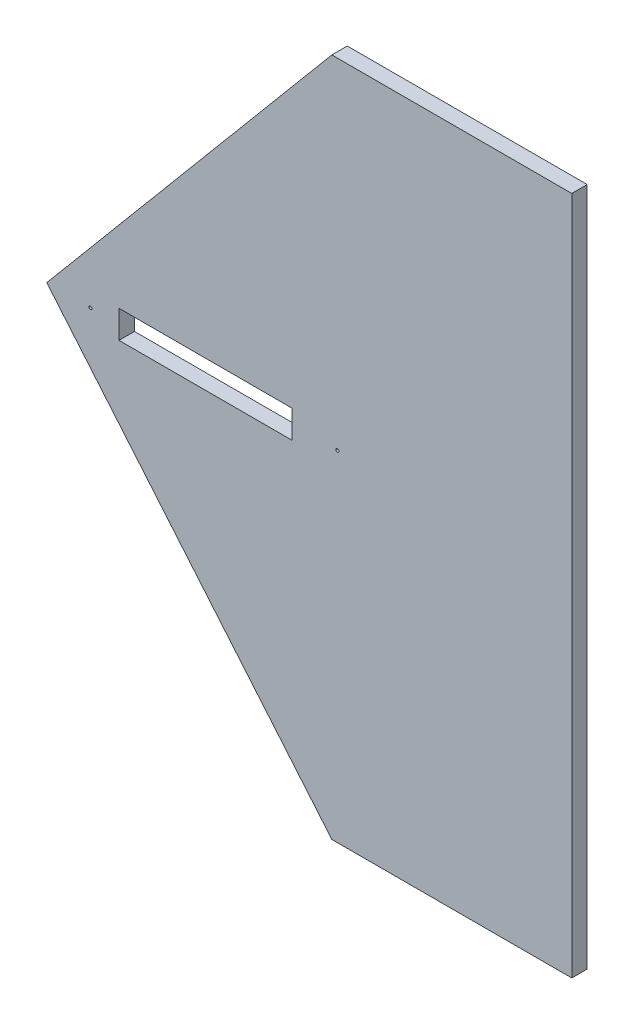
ISO-10303-21;
HEADER;
FILE_DESCRIPTION(('STEP AP214'),'2;1');
FILE_NAME('part.step','',(''),(''),'','','');
FILE_SCHEMA(('AUTOMOTIVE_DESIGN { 1 0 10303 214 1 1 1 1 }'));
ENDSEC;
DATA;
#1=APPLICATION_CONTEXT('core data for automotive mechanical design processes');
#2=APPLICATION_PROTOCOL_DEFINITION('international standard','automotive_design',2000,#1);
#3=PRODUCT_CONTEXT('',#1,'mechanical');
#4=PRODUCT('Part','Part','',(#3));
#5=PRODUCT_RELATED_PRODUCT_CATEGORY('part','',(#4));
#6=PRODUCT_DEFINITION_FORMATION('','',#4);
#7=PRODUCT_DEFINITION_CONTEXT('part definition',#1,'design');
#8=PRODUCT_DEFINITION('design','',#6,#7);
#9=PRODUCT_DEFINITION_SHAPE('','',#8);
#10=(LENGTH_UNIT() NAMED_UNIT(*) SI_UNIT(.MILLI.,.METRE.));
#11=(NAMED_UNIT(*) PLANE_ANGLE_UNIT() SI_UNIT($,.RADIAN.));
#12=(NAMED_UNIT(*) SI_UNIT($,.STERADIAN.) SOLID_ANGLE_UNIT());
#13=UNCERTAINTY_MEASURE_WITH_UNIT(LENGTH_MEASURE(1.E-05),#10,'distance_accuracy_value','');
#14=(GEOMETRIC_REPRESENTATION_CONTEXT(3) GLOBAL_UNCERTAINTY_ASSIGNED_CONTEXT((#13)) GLOBAL_UNIT_ASSIGNED_CONTEXT((#10,
#11,#12)) REPRESENTATION_CONTEXT('',''));
#15=CARTESIAN_POINT('',(0.,0.,0.));
#16=DIRECTION('',(0.,0.,1.));
#17=DIRECTION('',(1.,0.,0.));
#18=AXIS2_PLACEMENT_3D('',#15,#16,#17);
#19=CARTESIAN_POINT('',(0.,0.,6.35));
#20=DIRECTION('',(0.,0.,-1.));
#21=DIRECTION('',(-1.,0.,0.));
#22=AXIS2_PLACEMENT_3D('',#19,#20,#21);
#23=PLANE('',#22);
#24=CARTESIAN_POINT('',(17.9578,0.,6.35));
#25=DIRECTION('',(0.,0.,1.));
#26=DIRECTION('',(1.,0.,0.));
#27=AXIS2_PLACEMENT_3D('',#24,#25,#26);
#28=CIRCLE('',#27,0.634999999999999);
#29=CARTESIAN_POINT('',(18.5928,0.,6.35));
#30=VERTEX_POINT('',#29);
#31=EDGE_CURVE('E144',#30,#30,#28,.T.);
#32=ORIENTED_EDGE('',*,*,#31,.F.);
#33=EDGE_LOOP('',(#32));
#34=FACE_BOUND('',#33,.T.);
#35=DIRECTION('',(-1.,0.,0.));
#36=VECTOR('',#35,1.);
#37=CARTESIAN_POINT('',(117.222218475466,139.7,6.35));
#38=LINE('',#37,#36);
#39=CARTESIAN_POINT('',(215.9,139.7,6.35));
#40=VERTEX_POINT('',#39);
#41=CARTESIAN_POINT('',(117.222218475466,139.7,6.35));
#42=VERTEX_POINT('',#41);
#43=EDGE_CURVE('E157',#40,#42,#38,.T.);
#44=ORIENTED_EDGE('',*,*,#43,.T.);
#45=DIRECTION('',(-0.642787609686538,-0.766044443118979,0.));
#46=VECTOR('',#45,1.);
#47=CARTESIAN_POINT('',(0.,0.,6.35));
#48=LINE('',#47,#46);
#49=CARTESIAN_POINT('',(0.,0.,6.35));
#50=VERTEX_POINT('',#49);
#51=EDGE_CURVE('E160',#42,#50,#48,.T.);
#52=ORIENTED_EDGE('',*,*,#51,.T.);
#53=DIRECTION('',(0.642787609686538,-0.766044443118979,0.));
#54=VECTOR('',#53,1.);
#55=CARTESIAN_POINT('',(117.222218475466,-139.7,6.35));
#56=LINE('',#55,#54);
#57=CARTESIAN_POINT('',(117.222218475466,-139.7,6.35));
#58=VERTEX_POINT('',#57);
#59=EDGE_CURVE('E163',#50,#58,#56,.T.);
#60=ORIENTED_EDGE('',*,*,#59,.T.);
#61=DIRECTION('',(1.,0.,0.));
#62=VECTOR('',#61,1.);
#63=CARTESIAN_POINT('',(215.9,-139.7,6.35));
#64=LINE('',#63,#62);
#65=CARTESIAN_POINT('',(215.9,-139.7,6.35));
#66=VERTEX_POINT('',#65);
#67=EDGE_CURVE('E166',#58,#66,#64,.T.);
#68=ORIENTED_EDGE('',*,*,#67,.T.);
#69=DIRECTION('',(0.,1.,0.));
#70=VECTOR('',#69,1.);
#71=CARTESIAN_POINT('',(215.9,139.7,6.35));
#72=LINE('',#71,#70);
#73=EDGE_CURVE('E169',#66,#40,#72,.T.);
#74=ORIENTED_EDGE('',*,*,#73,.T.);
#75=EDGE_LOOP('',(#44,#52,#60,#68,#74));
#76=FACE_BOUND('',#75,.T.);
#77=DIRECTION('',(0.,-1.,0.));
#78=VECTOR('',#77,1.);
#79=CARTESIAN_POINT('',(29.718,5.715,6.35));
#80=LINE('',#79,#78);
#81=CARTESIAN_POINT('',(29.718,5.715,6.35));
#82=VERTEX_POINT('',#81);
#83=CARTESIAN_POINT('',(29.718,-5.715,6.35));
#84=VERTEX_POINT('',#83);
#85=EDGE_CURVE('E107',#82,#84,#80,.T.);
#86=ORIENTED_EDGE('',*,*,#85,.F.);
#87=DIRECTION('',(-1.,0.,0.));
#88=VECTOR('',#87,1.);
#89=CARTESIAN_POINT('',(29.718,5.715,6.35));
#90=LINE('',#89,#88);
#91=CARTESIAN_POINT('',(100.838,5.715,6.35));
#92=VERTEX_POINT('',#91);
#93=EDGE_CURVE('E136',#92,#82,#90,.T.);
#94=ORIENTED_EDGE('',*,*,#93,.F.);
#95=DIRECTION('',(0.,1.,0.));
#96=VECTOR('',#95,1.);
#97=CARTESIAN_POINT('',(100.838,5.715,6.35));
#98=LINE('',#97,#96);
#99=CARTESIAN_POINT('',(100.838,-5.715,6.35));
#100=VERTEX_POINT('',#99);
#101=EDGE_CURVE('E129',#100,#92,#98,.T.);
#102=ORIENTED_EDGE('',*,*,#101,.F.);
#103=DIRECTION('',(1.,0.,0.));
#104=VECTOR('',#103,1.);
#105=CARTESIAN_POINT('',(29.718,-5.715,6.35));
#106=LINE('',#105,#104);
#107=EDGE_CURVE('E116',#84,#100,#106,.T.);
#108=ORIENTED_EDGE('',*,*,#107,.F.);
#109=EDGE_LOOP('',(#86,#94,#102,#108));
#110=FACE_BOUND('',#109,.T.);
#111=CARTESIAN_POINT('',(119.5578,0.,6.35));
#112=DIRECTION('',(0.,0.,1.));
#113=DIRECTION('',(1.,0.,0.));
#114=AXIS2_PLACEMENT_3D('',#111,#112,#113);
#115=CIRCLE('',#114,0.635000000000002);
#116=CARTESIAN_POINT('',(120.1928,0.,6.35));
#117=VERTEX_POINT('',#116);
#118=EDGE_CURVE('E352',#117,#117,#115,.T.);
#119=ORIENTED_EDGE('',*,*,#118,.F.);
#120=EDGE_LOOP('',(#119));
#121=FACE_BOUND('',#120,.T.);
#122=ADVANCED_FACE('F36',(#34,#76,#110,#121),#23,.F.);
#123=CARTESIAN_POINT('',(0.,0.,0.));
#124=DIRECTION('',(0.,0.,-1.));
#125=DIRECTION('',(-1.,0.,0.));
#126=AXIS2_PLACEMENT_3D('',#123,#124,#125);
#127=PLANE('',#126);
#128=CARTESIAN_POINT('',(17.9578,0.,0.));
#129=DIRECTION('',(0.,0.,1.));
#130=DIRECTION('',(1.,0.,0.));
#131=AXIS2_PLACEMENT_3D('',#128,#129,#130);
#132=CIRCLE('',#131,0.634999999999999);
#133=CARTESIAN_POINT('',(18.5928,0.,0.));
#134=VERTEX_POINT('',#133);
#135=EDGE_CURVE('E358',#134,#134,#132,.T.);
#136=ORIENTED_EDGE('',*,*,#135,.T.);
#137=EDGE_LOOP('',(#136));
#138=FACE_BOUND('',#137,.T.);
#139=DIRECTION('',(-1.,0.,0.));
#140=VECTOR('',#139,1.);
#141=CARTESIAN_POINT('',(117.222218475466,139.7,0.));
#142=LINE('',#141,#140);
#143=CARTESIAN_POINT('',(215.9,139.7,0.));
#144=VERTEX_POINT('',#143);
#145=CARTESIAN_POINT('',(117.222218475466,139.7,0.));
#146=VERTEX_POINT('',#145);
#147=EDGE_CURVE('E124',#144,#146,#142,.T.);
#148=ORIENTED_EDGE('',*,*,#147,.F.);
#149=DIRECTION('',(0.,1.,0.));
#150=VECTOR('',#149,1.);
#151=CARTESIAN_POINT('',(215.9,139.7,0.));
#152=LINE('',#151,#150);
#153=CARTESIAN_POINT('',(215.9,-139.7,0.));
#154=VERTEX_POINT('',#153);
#155=EDGE_CURVE('E161',#154,#144,#152,.T.);
#156=ORIENTED_EDGE('',*,*,#155,.F.);
#157=DIRECTION('',(1.,0.,0.));
#158=VECTOR('',#157,1.);
#159=CARTESIAN_POINT('',(215.9,-139.7,0.));
#160=LINE('',#159,#158);
#161=CARTESIAN_POINT('',(117.222218475466,-139.7,0.));
#162=VERTEX_POINT('',#161);
#163=EDGE_CURVE('E180',#162,#154,#160,.T.);
#164=ORIENTED_EDGE('',*,*,#163,.F.);
#165=DIRECTION('',(0.642787609686538,-0.766044443118979,0.));
#166=VECTOR('',#165,1.);
#167=CARTESIAN_POINT('',(117.222218475466,-139.7,0.));
#168=LINE('',#167,#166);
#169=CARTESIAN_POINT('',(0.,0.,0.));
#170=VERTEX_POINT('',#169);
#171=EDGE_CURVE('E177',#170,#162,#168,.T.);
#172=ORIENTED_EDGE('',*,*,#171,.F.);
#173=DIRECTION('',(-0.642787609686538,-0.766044443118979,0.));
#174=VECTOR('',#173,1.);
#175=CARTESIAN_POINT('',(0.,0.,0.));
#176=LINE('',#175,#174);
#177=EDGE_CURVE('E175',#146,#170,#176,.T.);
#178=ORIENTED_EDGE('',*,*,#177,.F.);
#179=EDGE_LOOP('',(#148,#156,#164,#172,#178));
#180=FACE_BOUND('',#179,.T.);
#181=DIRECTION('',(-1.,0.,0.));
#182=VECTOR('',#181,1.);
#183=CARTESIAN_POINT('',(29.718,5.715,0.));
#184=LINE('',#183,#182);
#185=CARTESIAN_POINT('',(100.838,5.715,0.));
#186=VERTEX_POINT('',#185);
#187=CARTESIAN_POINT('',(29.718,5.715,0.));
#188=VERTEX_POINT('',#187);
#189=EDGE_CURVE('E117',#186,#188,#184,.T.);
#190=ORIENTED_EDGE('',*,*,#189,.T.);
#191=DIRECTION('',(0.,-1.,0.));
#192=VECTOR('',#191,1.);
#193=CARTESIAN_POINT('',(29.718,5.715,0.));
#194=LINE('',#193,#192);
#195=CARTESIAN_POINT('',(29.718,-5.715,0.));
#196=VERTEX_POINT('',#195);
#197=EDGE_CURVE('E59',#188,#196,#194,.T.);
#198=ORIENTED_EDGE('',*,*,#197,.T.);
#199=DIRECTION('',(1.,0.,0.));
#200=VECTOR('',#199,1.);
#201=CARTESIAN_POINT('',(29.718,-5.715,0.));
#202=LINE('',#201,#200);
#203=CARTESIAN_POINT('',(100.838,-5.715,0.));
#204=VERTEX_POINT('',#203);
#205=EDGE_CURVE('E123',#196,#204,#202,.T.);
#206=ORIENTED_EDGE('',*,*,#205,.T.);
#207=DIRECTION('',(0.,1.,0.));
#208=VECTOR('',#207,1.);
#209=CARTESIAN_POINT('',(100.838,5.715,0.));
#210=LINE('',#209,#208);
#211=EDGE_CURVE('E147',#204,#186,#210,.T.);
#212=ORIENTED_EDGE('',*,*,#211,.T.);
#213=EDGE_LOOP('',(#190,#198,#206,#212));
#214=FACE_BOUND('',#213,.T.);
#215=CARTESIAN_POINT('',(119.5578,0.,0.));
#216=DIRECTION('',(0.,0.,1.));
#217=DIRECTION('',(1.,0.,0.));
#218=AXIS2_PLACEMENT_3D('',#215,#216,#217);
#219=CIRCLE('',#218,0.635000000000002);
#220=CARTESIAN_POINT('',(120.1928,0.,0.));
#221=VERTEX_POINT('',#220);
#222=EDGE_CURVE('E355',#221,#221,#219,.T.);
#223=ORIENTED_EDGE('',*,*,#222,.T.);
#224=EDGE_LOOP('',(#223));
#225=FACE_BOUND('',#224,.T.);
#226=ADVANCED_FACE('F204',(#138,#180,#214,#225),#127,.T.);
#227=CARTESIAN_POINT('',(117.222218475466,139.7,6.35));
#228=DIRECTION('',(0.,-1.,0.));
#229=DIRECTION('',(0.,0.,-1.));
#230=AXIS2_PLACEMENT_3D('',#227,#228,#229);
#231=PLANE('',#230);
#232=ORIENTED_EDGE('',*,*,#147,.T.);
#233=DIRECTION('',(0.,0.,-1.));
#234=VECTOR('',#233,1.);
#235=CARTESIAN_POINT('',(117.222218475466,139.7,6.35));
#236=LINE('',#235,#234);
#237=EDGE_CURVE('E11',#42,#146,#236,.T.);
#238=ORIENTED_EDGE('',*,*,#237,.F.);
#239=ORIENTED_EDGE('',*,*,#43,.F.);
#240=DIRECTION('',(0.,0.,-1.));
#241=VECTOR('',#240,1.);
#242=CARTESIAN_POINT('',(215.9,139.7,6.35));
#243=LINE('',#242,#241);
#244=EDGE_CURVE('E172',#40,#144,#243,.T.);
#245=ORIENTED_EDGE('',*,*,#244,.T.);
#246=EDGE_LOOP('',(#232,#238,#239,#245));
#247=FACE_BOUND('',#246,.T.);
#248=ADVANCED_FACE('F38',(#247),#231,.F.);
#249=CARTESIAN_POINT('',(0.,0.,6.35));
#250=DIRECTION('',(0.766044443118979,-0.642787609686538,0.));
#251=DIRECTION('',(0.642787609686538,0.76604444311898,0.));
#252=AXIS2_PLACEMENT_3D('',#249,#250,#251);
#253=PLANE('',#252);
#254=ORIENTED_EDGE('',*,*,#177,.T.);
#255=DIRECTION('',(0.,0.,-1.));
#256=VECTOR('',#255,1.);
#257=CARTESIAN_POINT('',(0.,0.,6.35));
#258=LINE('',#257,#256);
#259=EDGE_CURVE('E44',#50,#170,#258,.T.);
#260=ORIENTED_EDGE('',*,*,#259,.F.);
#261=ORIENTED_EDGE('',*,*,#51,.F.);
#262=ORIENTED_EDGE('',*,*,#237,.T.);
#263=EDGE_LOOP('',(#254,#260,#261,#262));
#264=FACE_BOUND('',#263,.T.);
#265=ADVANCED_FACE('F218',(#264),#253,.F.);
#266=CARTESIAN_POINT('',(117.222218475466,-139.7,6.35));
#267=DIRECTION('',(0.766044443118979,0.642787609686538,0.));
#268=DIRECTION('',(-0.642787609686538,0.766044443118979,0.));
#269=AXIS2_PLACEMENT_3D('',#266,#267,#268);
#270=PLANE('',#269);
#271=ORIENTED_EDGE('',*,*,#171,.T.);
#272=DIRECTION('',(0.,0.,-1.));
#273=VECTOR('',#272,1.);
#274=CARTESIAN_POINT('',(117.222218475466,-139.7,6.35));
#275=LINE('',#274,#273);
#276=EDGE_CURVE('E190',#58,#162,#275,.T.);
#277=ORIENTED_EDGE('',*,*,#276,.F.);
#278=ORIENTED_EDGE('',*,*,#59,.F.);
#279=ORIENTED_EDGE('',*,*,#259,.T.);
#280=EDGE_LOOP('',(#271,#277,#278,#279));
#281=FACE_BOUND('',#280,.T.);
#282=ADVANCED_FACE('F198',(#281),#270,.F.);
#283=CARTESIAN_POINT('',(215.9,-139.7,6.35));
#284=DIRECTION('',(0.,1.,0.));
#285=DIRECTION('',(-1.,0.,0.));
#286=AXIS2_PLACEMENT_3D('',#283,#284,#285);
#287=PLANE('',#286);
#288=ORIENTED_EDGE('',*,*,#163,.T.);
#289=DIRECTION('',(0.,0.,-1.));
#290=VECTOR('',#289,1.);
#291=CARTESIAN_POINT('',(215.9,-139.7,6.35));
#292=LINE('',#291,#290);
#293=EDGE_CURVE('E187',#66,#154,#292,.T.);
#294=ORIENTED_EDGE('',*,*,#293,.F.);
#295=ORIENTED_EDGE('',*,*,#67,.F.);
#296=ORIENTED_EDGE('',*,*,#276,.T.);
#297=EDGE_LOOP('',(#288,#294,#295,#296));
#298=FACE_BOUND('',#297,.T.);
#299=ADVANCED_FACE('F209',(#298),#287,.F.);
#300=CARTESIAN_POINT('',(215.9,139.7,6.35));
#301=DIRECTION('',(-1.,0.,0.));
#302=DIRECTION('',(0.,-1.,0.));
#303=AXIS2_PLACEMENT_3D('',#300,#301,#302);
#304=PLANE('',#303);
#305=ORIENTED_EDGE('',*,*,#155,.T.);
#306=ORIENTED_EDGE('',*,*,#244,.F.);
#307=ORIENTED_EDGE('',*,*,#73,.F.);
#308=ORIENTED_EDGE('',*,*,#293,.T.);
#309=EDGE_LOOP('',(#305,#306,#307,#308));
#310=FACE_BOUND('',#309,.T.);
#311=ADVANCED_FACE('F213',(#310),#304,.F.);
#312=CARTESIAN_POINT('',(29.718,5.715,6.35));
#313=DIRECTION('',(1.,0.,0.));
#314=DIRECTION('',(0.,0.,-1.));
#315=AXIS2_PLACEMENT_3D('',#312,#313,#314);
#316=PLANE('',#315);
#317=ORIENTED_EDGE('',*,*,#197,.F.);
#318=DIRECTION('',(0.,0.,-1.));
#319=VECTOR('',#318,1.);
#320=CARTESIAN_POINT('',(29.718,5.715,6.35));
#321=LINE('',#320,#319);
#322=EDGE_CURVE('E111',#82,#188,#321,.T.);
#323=ORIENTED_EDGE('',*,*,#322,.F.);
#324=ORIENTED_EDGE('',*,*,#85,.T.);
#325=DIRECTION('',(0.,0.,-1.));
#326=VECTOR('',#325,1.);
#327=CARTESIAN_POINT('',(29.718,-5.715,6.35));
#328=LINE('',#327,#326);
#329=EDGE_CURVE('E110',#84,#196,#328,.T.);
#330=ORIENTED_EDGE('',*,*,#329,.T.);
#331=EDGE_LOOP('',(#317,#323,#324,#330));
#332=FACE_BOUND('',#331,.T.);
#333=ADVANCED_FACE('F109',(#332),#316,.T.);
#334=CARTESIAN_POINT('',(29.718,-5.715,6.35));
#335=DIRECTION('',(0.,1.,0.));
#336=DIRECTION('',(0.,0.,1.));
#337=AXIS2_PLACEMENT_3D('',#334,#335,#336);
#338=PLANE('',#337);
#339=ORIENTED_EDGE('',*,*,#205,.F.);
#340=ORIENTED_EDGE('',*,*,#329,.F.);
#341=ORIENTED_EDGE('',*,*,#107,.T.);
#342=DIRECTION('',(0.,0.,-1.));
#343=VECTOR('',#342,1.);
#344=CARTESIAN_POINT('',(100.838,-5.715,6.35));
#345=LINE('',#344,#343);
#346=EDGE_CURVE('E125',#100,#204,#345,.T.);
#347=ORIENTED_EDGE('',*,*,#346,.T.);
#348=EDGE_LOOP('',(#339,#340,#341,#347));
#349=FACE_BOUND('',#348,.T.);
#350=ADVANCED_FACE('F120',(#349),#338,.T.);
#351=CARTESIAN_POINT('',(100.838,5.715,6.35));
#352=DIRECTION('',(-1.,0.,0.));
#353=DIRECTION('',(0.,0.,1.));
#354=AXIS2_PLACEMENT_3D('',#351,#352,#353);
#355=PLANE('',#354);
#356=ORIENTED_EDGE('',*,*,#211,.F.);
#357=ORIENTED_EDGE('',*,*,#346,.F.);
#358=ORIENTED_EDGE('',*,*,#101,.T.);
#359=DIRECTION('',(0.,0.,-1.));
#360=VECTOR('',#359,1.);
#361=CARTESIAN_POINT('',(100.838,5.715,6.35));
#362=LINE('',#361,#360);
#363=EDGE_CURVE('E51',#92,#186,#362,.T.);
#364=ORIENTED_EDGE('',*,*,#363,.T.);
#365=EDGE_LOOP('',(#356,#357,#358,#364));
#366=FACE_BOUND('',#365,.T.);
#367=ADVANCED_FACE('F265',(#366),#355,.T.);
#368=CARTESIAN_POINT('',(29.718,5.715,6.35));
#369=DIRECTION('',(0.,-1.,0.));
#370=DIRECTION('',(0.,0.,-1.));
#371=AXIS2_PLACEMENT_3D('',#368,#369,#370);
#372=PLANE('',#371);
#373=ORIENTED_EDGE('',*,*,#189,.F.);
#374=ORIENTED_EDGE('',*,*,#363,.F.);
#375=ORIENTED_EDGE('',*,*,#93,.T.);
#376=ORIENTED_EDGE('',*,*,#322,.T.);
#377=EDGE_LOOP('',(#373,#374,#375,#376));
#378=FACE_BOUND('',#377,.T.);
#379=ADVANCED_FACE('F272',(#378),#372,.T.);
#380=CARTESIAN_POINT('',(17.9578,0.,6.35));
#381=DIRECTION('',(0.,0.,-1.));
#382=DIRECTION('',(-1.,0.,0.));
#383=AXIS2_PLACEMENT_3D('',#380,#381,#382);
#384=CYLINDRICAL_SURFACE('',#383,0.634999999999999);
#385=ORIENTED_EDGE('',*,*,#31,.T.);
#386=EDGE_LOOP('',(#385));
#387=FACE_BOUND('',#386,.T.);
#388=ORIENTED_EDGE('',*,*,#135,.F.);
#389=EDGE_LOOP('',(#388));
#390=FACE_BOUND('',#389,.T.);
#391=ADVANCED_FACE('F280',(#387,#390),#384,.F.);
#392=CARTESIAN_POINT('',(119.5578,0.,6.35));
#393=DIRECTION('',(0.,0.,-1.));
#394=DIRECTION('',(-1.,0.,0.));
#395=AXIS2_PLACEMENT_3D('',#392,#393,#394);
#396=CYLINDRICAL_SURFACE('',#395,0.635000000000002);
#397=ORIENTED_EDGE('',*,*,#118,.T.);
#398=EDGE_LOOP('',(#397));
#399=FACE_BOUND('',#398,.T.);
#400=ORIENTED_EDGE('',*,*,#222,.F.);
#401=EDGE_LOOP('',(#400));
#402=FACE_BOUND('',#401,.T.);
#403=ADVANCED_FACE('F286',(#399,#402),#396,.F.);
#404=CLOSED_SHELL('',(#122,#226,#248,#265,#282,#299,#311,#333,#350,#367,#379,#391,#403));
#405=MANIFOLD_SOLID_BREP('B2',#404);
#406=ADVANCED_BREP_SHAPE_REPRESENTATION('',(#18,#405),#14);
#407=SHAPE_DEFINITION_REPRESENTATION(#9,#406);
ENDSEC;
END-ISO-10303-21;
